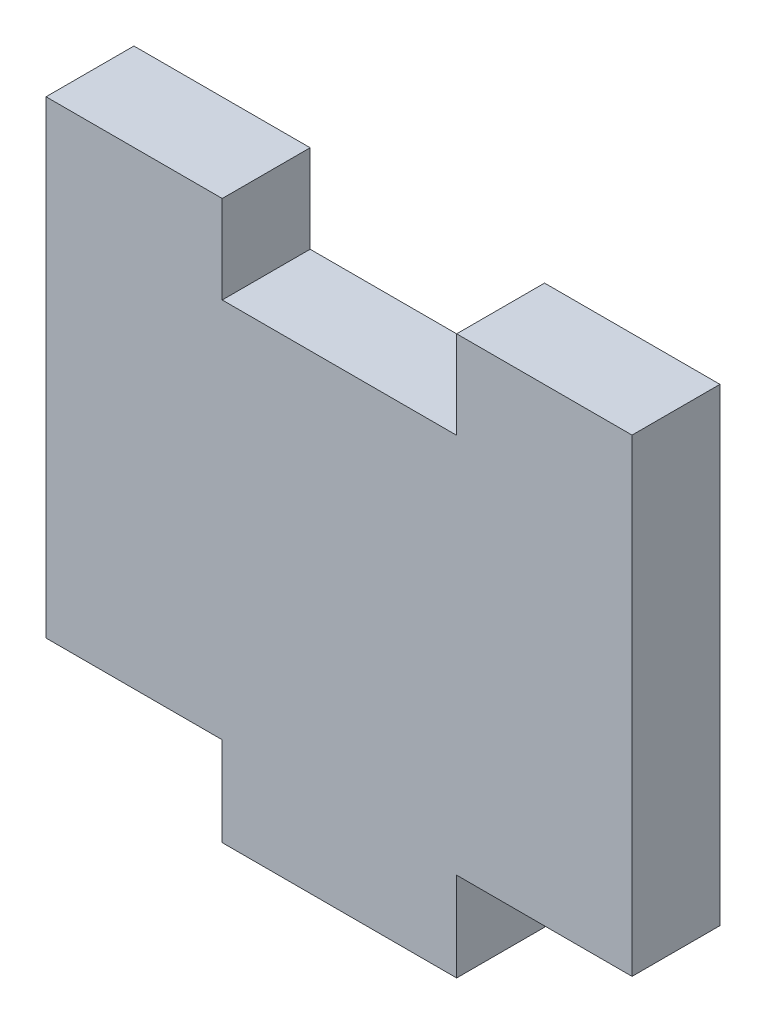
ISO-10303-21;
HEADER;
FILE_DESCRIPTION(('STEP AP214'),'2;1');
FILE_NAME('part.step','',(''),(''),'','','');
FILE_SCHEMA(('AUTOMOTIVE_DESIGN { 1 0 10303 214 1 1 1 1 }'));
ENDSEC;
DATA;
#1=APPLICATION_CONTEXT('core data for automotive mechanical design processes');
#2=APPLICATION_PROTOCOL_DEFINITION('international standard','automotive_design',2000,#1);
#3=PRODUCT_CONTEXT('',#1,'mechanical');
#4=PRODUCT('Part','Part','',(#3));
#5=PRODUCT_RELATED_PRODUCT_CATEGORY('part','',(#4));
#6=PRODUCT_DEFINITION_FORMATION('','',#4);
#7=PRODUCT_DEFINITION_CONTEXT('part definition',#1,'design');
#8=PRODUCT_DEFINITION('design','',#6,#7);
#9=PRODUCT_DEFINITION_SHAPE('','',#8);
#10=(LENGTH_UNIT() NAMED_UNIT(*) SI_UNIT(.MILLI.,.METRE.));
#11=(NAMED_UNIT(*) PLANE_ANGLE_UNIT() SI_UNIT($,.RADIAN.));
#12=(NAMED_UNIT(*) SI_UNIT($,.STERADIAN.) SOLID_ANGLE_UNIT());
#13=UNCERTAINTY_MEASURE_WITH_UNIT(LENGTH_MEASURE(1.E-05),#10,'distance_accuracy_value','');
#14=(GEOMETRIC_REPRESENTATION_CONTEXT(3) GLOBAL_UNCERTAINTY_ASSIGNED_CONTEXT((#13)) GLOBAL_UNIT_ASSIGNED_CONTEXT((#10,
#11,#12)) REPRESENTATION_CONTEXT('',''));
#15=CARTESIAN_POINT('',(0.,0.,0.));
#16=DIRECTION('',(0.,0.,1.));
#17=DIRECTION('',(1.,0.,0.));
#18=AXIS2_PLACEMENT_3D('',#15,#16,#17);
#19=CARTESIAN_POINT('',(0.,0.,9.525));
#20=DIRECTION('',(1.,0.,0.));
#21=DIRECTION('',(0.,0.,-1.));
#22=AXIS2_PLACEMENT_3D('',#19,#20,#21);
#23=PLANE('',#22);
#24=DIRECTION('',(0.,-1.,0.));
#25=VECTOR('',#24,1.);
#26=CARTESIAN_POINT('',(0.,0.,0.));
#27=LINE('',#26,#25);
#28=CARTESIAN_POINT('',(0.,50.8,0.));
#29=VERTEX_POINT('',#28);
#30=CARTESIAN_POINT('',(0.,0.,0.));
#31=VERTEX_POINT('',#30);
#32=EDGE_CURVE('E164',#29,#31,#27,.T.);
#33=ORIENTED_EDGE('',*,*,#32,.T.);
#34=DIRECTION('',(0.,0.,-1.));
#35=VECTOR('',#34,1.);
#36=CARTESIAN_POINT('',(0.,0.,9.525));
#37=LINE('',#36,#35);
#38=CARTESIAN_POINT('',(0.,0.,9.525));
#39=VERTEX_POINT('',#38);
#40=EDGE_CURVE('E11',#39,#31,#37,.T.);
#41=ORIENTED_EDGE('',*,*,#40,.F.);
#42=DIRECTION('',(0.,-1.,0.));
#43=VECTOR('',#42,1.);
#44=CARTESIAN_POINT('',(0.,0.,9.525));
#45=LINE('',#44,#43);
#46=CARTESIAN_POINT('',(0.,50.8,9.525));
#47=VERTEX_POINT('',#46);
#48=EDGE_CURVE('E199',#47,#39,#45,.T.);
#49=ORIENTED_EDGE('',*,*,#48,.F.);
#50=DIRECTION('',(0.,0.,-1.));
#51=VECTOR('',#50,1.);
#52=CARTESIAN_POINT('',(0.,50.8,9.525));
#53=LINE('',#52,#51);
#54=EDGE_CURVE('E160',#47,#29,#53,.T.);
#55=ORIENTED_EDGE('',*,*,#54,.T.);
#56=EDGE_LOOP('',(#33,#41,#49,#55));
#57=FACE_BOUND('',#56,.T.);
#58=ADVANCED_FACE('F39',(#57),#23,.F.);
#59=CARTESIAN_POINT('',(0.,0.,9.525));
#60=DIRECTION('',(0.,1.,0.));
#61=DIRECTION('',(0.,0.,1.));
#62=AXIS2_PLACEMENT_3D('',#59,#60,#61);
#63=PLANE('',#62);
#64=DIRECTION('',(1.,0.,0.));
#65=VECTOR('',#64,1.);
#66=CARTESIAN_POINT('',(0.,0.,0.));
#67=LINE('',#66,#65);
#68=CARTESIAN_POINT('',(19.0934901692059,0.,0.));
#69=VERTEX_POINT('',#68);
#70=EDGE_CURVE('E168',#31,#69,#67,.T.);
#71=ORIENTED_EDGE('',*,*,#70,.T.);
#72=DIRECTION('',(0.,0.,-1.));
#73=VECTOR('',#72,1.);
#74=CARTESIAN_POINT('',(19.0934901692059,0.,9.525));
#75=LINE('',#74,#73);
#76=CARTESIAN_POINT('',(19.0934901692059,0.,9.525));
#77=VERTEX_POINT('',#76);
#78=EDGE_CURVE('E48',#77,#69,#75,.T.);
#79=ORIENTED_EDGE('',*,*,#78,.F.);
#80=DIRECTION('',(1.,0.,0.));
#81=VECTOR('',#80,1.);
#82=CARTESIAN_POINT('',(0.,0.,9.525));
#83=LINE('',#82,#81);
#84=EDGE_CURVE('E111',#39,#77,#83,.T.);
#85=ORIENTED_EDGE('',*,*,#84,.F.);
#86=ORIENTED_EDGE('',*,*,#40,.T.);
#87=EDGE_LOOP('',(#71,#79,#85,#86));
#88=FACE_BOUND('',#87,.T.);
#89=ADVANCED_FACE('F293',(#88),#63,.F.);
#90=CARTESIAN_POINT('',(19.0934901692059,0.,9.525));
#91=DIRECTION('',(1.,0.,0.));
#92=DIRECTION('',(0.,0.,-1.));
#93=AXIS2_PLACEMENT_3D('',#90,#91,#92);
#94=PLANE('',#93);
#95=DIRECTION('',(0.,-1.,0.));
#96=VECTOR('',#95,1.);
#97=CARTESIAN_POINT('',(19.0934901692059,0.,0.));
#98=LINE('',#97,#96);
#99=CARTESIAN_POINT('',(19.0934901692059,-9.652,0.));
#100=VERTEX_POINT('',#99);
#101=EDGE_CURVE('E171',#69,#100,#98,.T.);
#102=ORIENTED_EDGE('',*,*,#101,.T.);
#103=DIRECTION('',(0.,0.,-1.));
#104=VECTOR('',#103,1.);
#105=CARTESIAN_POINT('',(19.0934901692059,-9.652,9.525));
#106=LINE('',#105,#104);
#107=CARTESIAN_POINT('',(19.0934901692059,-9.652,9.525));
#108=VERTEX_POINT('',#107);
#109=EDGE_CURVE('E226',#108,#100,#106,.T.);
#110=ORIENTED_EDGE('',*,*,#109,.F.);
#111=DIRECTION('',(0.,-1.,0.));
#112=VECTOR('',#111,1.);
#113=CARTESIAN_POINT('',(19.0934901692059,0.,9.525));
#114=LINE('',#113,#112);
#115=EDGE_CURVE('E236',#77,#108,#114,.T.);
#116=ORIENTED_EDGE('',*,*,#115,.F.);
#117=ORIENTED_EDGE('',*,*,#78,.T.);
#118=EDGE_LOOP('',(#102,#110,#116,#117));
#119=FACE_BOUND('',#118,.T.);
#120=ADVANCED_FACE('F234',(#119),#94,.F.);
#121=CARTESIAN_POINT('',(19.0934901692059,-9.652,9.525));
#122=DIRECTION('',(0.,1.,0.));
#123=DIRECTION('',(0.,0.,1.));
#124=AXIS2_PLACEMENT_3D('',#121,#122,#123);
#125=PLANE('',#124);
#126=DIRECTION('',(1.,0.,0.));
#127=VECTOR('',#126,1.);
#128=CARTESIAN_POINT('',(19.0934901692059,-9.652,0.));
#129=LINE('',#128,#127);
#130=CARTESIAN_POINT('',(44.4934901692059,-9.652,0.));
#131=VERTEX_POINT('',#130);
#132=EDGE_CURVE('E174',#100,#131,#129,.T.);
#133=ORIENTED_EDGE('',*,*,#132,.T.);
#134=DIRECTION('',(0.,0.,-1.));
#135=VECTOR('',#134,1.);
#136=CARTESIAN_POINT('',(44.4934901692059,-9.652,9.525));
#137=LINE('',#136,#135);
#138=CARTESIAN_POINT('',(44.4934901692059,-9.652,9.525));
#139=VERTEX_POINT('',#138);
#140=EDGE_CURVE('E222',#139,#131,#137,.T.);
#141=ORIENTED_EDGE('',*,*,#140,.F.);
#142=DIRECTION('',(1.,0.,0.));
#143=VECTOR('',#142,1.);
#144=CARTESIAN_POINT('',(19.0934901692059,-9.652,9.525));
#145=LINE('',#144,#143);
#146=EDGE_CURVE('E255',#108,#139,#145,.T.);
#147=ORIENTED_EDGE('',*,*,#146,.F.);
#148=ORIENTED_EDGE('',*,*,#109,.T.);
#149=EDGE_LOOP('',(#133,#141,#147,#148));
#150=FACE_BOUND('',#149,.T.);
#151=ADVANCED_FACE('F245',(#150),#125,.F.);
#152=CARTESIAN_POINT('',(44.4934901692059,0.,9.525));
#153=DIRECTION('',(-1.,0.,0.));
#154=DIRECTION('',(0.,-1.,0.));
#155=AXIS2_PLACEMENT_3D('',#152,#153,#154);
#156=PLANE('',#155);
#157=DIRECTION('',(0.,1.,0.));
#158=VECTOR('',#157,1.);
#159=CARTESIAN_POINT('',(44.4934901692059,0.,0.));
#160=LINE('',#159,#158);
#161=CARTESIAN_POINT('',(44.4934901692059,0.,0.));
#162=VERTEX_POINT('',#161);
#163=EDGE_CURVE('E177',#131,#162,#160,.T.);
#164=ORIENTED_EDGE('',*,*,#163,.T.);
#165=DIRECTION('',(0.,0.,-1.));
#166=VECTOR('',#165,1.);
#167=CARTESIAN_POINT('',(44.4934901692059,0.,9.525));
#168=LINE('',#167,#166);
#169=CARTESIAN_POINT('',(44.4934901692059,0.,9.525));
#170=VERTEX_POINT('',#169);
#171=EDGE_CURVE('E218',#170,#162,#168,.T.);
#172=ORIENTED_EDGE('',*,*,#171,.F.);
#173=DIRECTION('',(0.,1.,0.));
#174=VECTOR('',#173,1.);
#175=CARTESIAN_POINT('',(44.4934901692059,0.,9.525));
#176=LINE('',#175,#174);
#177=EDGE_CURVE('E251',#139,#170,#176,.T.);
#178=ORIENTED_EDGE('',*,*,#177,.F.);
#179=ORIENTED_EDGE('',*,*,#140,.T.);
#180=EDGE_LOOP('',(#164,#172,#178,#179));
#181=FACE_BOUND('',#180,.T.);
#182=ADVANCED_FACE('F249',(#181),#156,.F.);
#183=CARTESIAN_POINT('',(44.4934901692059,0.,9.525));
#184=DIRECTION('',(0.,1.,0.));
#185=DIRECTION('',(0.,0.,1.));
#186=AXIS2_PLACEMENT_3D('',#183,#184,#185);
#187=PLANE('',#186);
#188=DIRECTION('',(1.,0.,0.));
#189=VECTOR('',#188,1.);
#190=CARTESIAN_POINT('',(44.4934901692059,0.,0.));
#191=LINE('',#190,#189);
#192=CARTESIAN_POINT('',(63.5,0.,0.));
#193=VERTEX_POINT('',#192);
#194=EDGE_CURVE('E180',#162,#193,#191,.T.);
#195=ORIENTED_EDGE('',*,*,#194,.T.);
#196=DIRECTION('',(0.,0.,-1.));
#197=VECTOR('',#196,1.);
#198=CARTESIAN_POINT('',(63.5,0.,9.525));
#199=LINE('',#198,#197);
#200=CARTESIAN_POINT('',(63.5,0.,9.525));
#201=VERTEX_POINT('',#200);
#202=EDGE_CURVE('E214',#201,#193,#199,.T.);
#203=ORIENTED_EDGE('',*,*,#202,.F.);
#204=DIRECTION('',(1.,0.,0.));
#205=VECTOR('',#204,1.);
#206=CARTESIAN_POINT('',(44.4934901692059,0.,9.525));
#207=LINE('',#206,#205);
#208=EDGE_CURVE('E254',#170,#201,#207,.T.);
#209=ORIENTED_EDGE('',*,*,#208,.F.);
#210=ORIENTED_EDGE('',*,*,#171,.T.);
#211=EDGE_LOOP('',(#195,#203,#209,#210));
#212=FACE_BOUND('',#211,.T.);
#213=ADVANCED_FACE('F306',(#212),#187,.F.);
#214=CARTESIAN_POINT('',(63.5,38.1,9.525));
#215=DIRECTION('',(-1.,0.,0.));
#216=DIRECTION('',(0.,0.,1.));
#217=AXIS2_PLACEMENT_3D('',#214,#215,#216);
#218=PLANE('',#217);
#219=DIRECTION('',(0.,1.,0.));
#220=VECTOR('',#219,1.);
#221=CARTESIAN_POINT('',(63.5,38.1,0.));
#222=LINE('',#221,#220);
#223=CARTESIAN_POINT('',(63.5,50.8,0.));
#224=VERTEX_POINT('',#223);
#225=EDGE_CURVE('E184',#193,#224,#222,.T.);
#226=ORIENTED_EDGE('',*,*,#225,.T.);
#227=DIRECTION('',(0.,0.,-1.));
#228=VECTOR('',#227,1.);
#229=CARTESIAN_POINT('',(63.5,50.8,9.525));
#230=LINE('',#229,#228);
#231=CARTESIAN_POINT('',(63.5,50.8,9.525));
#232=VERTEX_POINT('',#231);
#233=EDGE_CURVE('E210',#232,#224,#230,.T.);
#234=ORIENTED_EDGE('',*,*,#233,.F.);
#235=DIRECTION('',(0.,1.,0.));
#236=VECTOR('',#235,1.);
#237=CARTESIAN_POINT('',(63.5,0.,9.525));
#238=LINE('',#237,#236);
#239=EDGE_CURVE('E259',#201,#232,#238,.T.);
#240=ORIENTED_EDGE('',*,*,#239,.F.);
#241=ORIENTED_EDGE('',*,*,#202,.T.);
#242=EDGE_LOOP('',(#226,#234,#240,#241));
#243=FACE_BOUND('',#242,.T.);
#244=ADVANCED_FACE('F309',(#243),#218,.F.);
#245=CARTESIAN_POINT('',(44.4934901692059,50.8,9.525));
#246=DIRECTION('',(0.,-1.,0.));
#247=DIRECTION('',(0.,0.,-1.));
#248=AXIS2_PLACEMENT_3D('',#245,#246,#247);
#249=PLANE('',#248);
#250=DIRECTION('',(-1.,0.,0.));
#251=VECTOR('',#250,1.);
#252=CARTESIAN_POINT('',(44.4934901692059,50.8,0.));
#253=LINE('',#252,#251);
#254=CARTESIAN_POINT('',(44.4934901692059,50.8,0.));
#255=VERTEX_POINT('',#254);
#256=EDGE_CURVE('E187',#224,#255,#253,.T.);
#257=ORIENTED_EDGE('',*,*,#256,.T.);
#258=DIRECTION('',(0.,0.,-1.));
#259=VECTOR('',#258,1.);
#260=CARTESIAN_POINT('',(44.4934901692059,50.8,9.525));
#261=LINE('',#260,#259);
#262=CARTESIAN_POINT('',(44.4934901692059,50.8,9.525));
#263=VERTEX_POINT('',#262);
#264=EDGE_CURVE('E206',#263,#255,#261,.T.);
#265=ORIENTED_EDGE('',*,*,#264,.F.);
#266=DIRECTION('',(-1.,0.,0.));
#267=VECTOR('',#266,1.);
#268=CARTESIAN_POINT('',(44.4934901692059,50.8,9.525));
#269=LINE('',#268,#267);
#270=EDGE_CURVE('E266',#232,#263,#269,.T.);
#271=ORIENTED_EDGE('',*,*,#270,.F.);
#272=ORIENTED_EDGE('',*,*,#233,.T.);
#273=EDGE_LOOP('',(#257,#265,#271,#272));
#274=FACE_BOUND('',#273,.T.);
#275=ADVANCED_FACE('F274',(#274),#249,.F.);
#276=CARTESIAN_POINT('',(44.4934901692059,50.8,9.525));
#277=DIRECTION('',(1.,0.,0.));
#278=DIRECTION('',(0.,0.,-1.));
#279=AXIS2_PLACEMENT_3D('',#276,#277,#278);
#280=PLANE('',#279);
#281=DIRECTION('',(0.,-1.,0.));
#282=VECTOR('',#281,1.);
#283=CARTESIAN_POINT('',(44.4934901692059,50.8,0.));
#284=LINE('',#283,#282);
#285=CARTESIAN_POINT('',(44.4934901692059,41.275,0.));
#286=VERTEX_POINT('',#285);
#287=EDGE_CURVE('E190',#255,#286,#284,.T.);
#288=ORIENTED_EDGE('',*,*,#287,.T.);
#289=DIRECTION('',(0.,0.,-1.));
#290=VECTOR('',#289,1.);
#291=CARTESIAN_POINT('',(44.4934901692059,41.275,9.525));
#292=LINE('',#291,#290);
#293=CARTESIAN_POINT('',(44.4934901692059,41.275,9.525));
#294=VERTEX_POINT('',#293);
#295=EDGE_CURVE('E153',#294,#286,#292,.T.);
#296=ORIENTED_EDGE('',*,*,#295,.F.);
#297=DIRECTION('',(0.,-1.,0.));
#298=VECTOR('',#297,1.);
#299=CARTESIAN_POINT('',(44.4934901692059,50.8,9.525));
#300=LINE('',#299,#298);
#301=EDGE_CURVE('E142',#263,#294,#300,.T.);
#302=ORIENTED_EDGE('',*,*,#301,.F.);
#303=ORIENTED_EDGE('',*,*,#264,.T.);
#304=EDGE_LOOP('',(#288,#296,#302,#303));
#305=FACE_BOUND('',#304,.T.);
#306=ADVANCED_FACE('F278',(#305),#280,.F.);
#307=CARTESIAN_POINT('',(19.0934901692059,41.275,9.525));
#308=DIRECTION('',(0.,-1.,0.));
#309=DIRECTION('',(0.,0.,-1.));
#310=AXIS2_PLACEMENT_3D('',#307,#308,#309);
#311=PLANE('',#310);
#312=DIRECTION('',(-1.,0.,0.));
#313=VECTOR('',#312,1.);
#314=CARTESIAN_POINT('',(19.0934901692059,41.275,0.));
#315=LINE('',#314,#313);
#316=CARTESIAN_POINT('',(19.0934901692059,41.275,0.));
#317=VERTEX_POINT('',#316);
#318=EDGE_CURVE('E151',#286,#317,#315,.T.);
#319=ORIENTED_EDGE('',*,*,#318,.T.);
#320=DIRECTION('',(0.,0.,-1.));
#321=VECTOR('',#320,1.);
#322=CARTESIAN_POINT('',(19.0934901692059,41.275,9.525));
#323=LINE('',#322,#321);
#324=CARTESIAN_POINT('',(19.0934901692059,41.275,9.525));
#325=VERTEX_POINT('',#324);
#326=EDGE_CURVE('E148',#325,#317,#323,.T.);
#327=ORIENTED_EDGE('',*,*,#326,.F.);
#328=DIRECTION('',(-1.,0.,0.));
#329=VECTOR('',#328,1.);
#330=CARTESIAN_POINT('',(19.0934901692059,41.275,9.525));
#331=LINE('',#330,#329);
#332=EDGE_CURVE('E136',#294,#325,#331,.T.);
#333=ORIENTED_EDGE('',*,*,#332,.F.);
#334=ORIENTED_EDGE('',*,*,#295,.T.);
#335=EDGE_LOOP('',(#319,#327,#333,#334));
#336=FACE_BOUND('',#335,.T.);
#337=ADVANCED_FACE('F149',(#336),#311,.F.);
#338=CARTESIAN_POINT('',(19.0934901692059,50.8,9.525));
#339=DIRECTION('',(-1.,0.,0.));
#340=DIRECTION('',(0.,0.,1.));
#341=AXIS2_PLACEMENT_3D('',#338,#339,#340);
#342=PLANE('',#341);
#343=DIRECTION('',(0.,1.,0.));
#344=VECTOR('',#343,1.);
#345=CARTESIAN_POINT('',(19.0934901692059,50.8,0.));
#346=LINE('',#345,#344);
#347=CARTESIAN_POINT('',(19.0934901692059,50.8,0.));
#348=VERTEX_POINT('',#347);
#349=EDGE_CURVE('E97',#317,#348,#346,.T.);
#350=ORIENTED_EDGE('',*,*,#349,.T.);
#351=DIRECTION('',(0.,0.,-1.));
#352=VECTOR('',#351,1.);
#353=CARTESIAN_POINT('',(19.0934901692059,50.8,9.525));
#354=LINE('',#353,#352);
#355=CARTESIAN_POINT('',(19.0934901692059,50.8,9.525));
#356=VERTEX_POINT('',#355);
#357=EDGE_CURVE('E154',#356,#348,#354,.T.);
#358=ORIENTED_EDGE('',*,*,#357,.F.);
#359=DIRECTION('',(0.,1.,0.));
#360=VECTOR('',#359,1.);
#361=CARTESIAN_POINT('',(19.0934901692059,50.8,9.525));
#362=LINE('',#361,#360);
#363=EDGE_CURVE('E140',#325,#356,#362,.T.);
#364=ORIENTED_EDGE('',*,*,#363,.F.);
#365=ORIENTED_EDGE('',*,*,#326,.T.);
#366=EDGE_LOOP('',(#350,#358,#364,#365));
#367=FACE_BOUND('',#366,.T.);
#368=ADVANCED_FACE('F156',(#367),#342,.F.);
#369=CARTESIAN_POINT('',(0.,50.8,9.525));
#370=DIRECTION('',(0.,-1.,0.));
#371=DIRECTION('',(0.,0.,-1.));
#372=AXIS2_PLACEMENT_3D('',#369,#370,#371);
#373=PLANE('',#372);
#374=DIRECTION('',(-1.,0.,0.));
#375=VECTOR('',#374,1.);
#376=CARTESIAN_POINT('',(0.,50.8,0.));
#377=LINE('',#376,#375);
#378=EDGE_CURVE('E103',#348,#29,#377,.T.);
#379=ORIENTED_EDGE('',*,*,#378,.T.);
#380=ORIENTED_EDGE('',*,*,#54,.F.);
#381=DIRECTION('',(-1.,0.,0.));
#382=VECTOR('',#381,1.);
#383=CARTESIAN_POINT('',(0.,50.8,9.525));
#384=LINE('',#383,#382);
#385=EDGE_CURVE('E56',#356,#47,#384,.T.);
#386=ORIENTED_EDGE('',*,*,#385,.F.);
#387=ORIENTED_EDGE('',*,*,#357,.T.);
#388=EDGE_LOOP('',(#379,#380,#386,#387));
#389=FACE_BOUND('',#388,.T.);
#390=ADVANCED_FACE('F282',(#389),#373,.F.);
#391=CARTESIAN_POINT('',(0.,0.,9.525));
#392=DIRECTION('',(0.,0.,-1.));
#393=DIRECTION('',(-1.,0.,0.));
#394=AXIS2_PLACEMENT_3D('',#391,#392,#393);
#395=PLANE('',#394);
#396=ORIENTED_EDGE('',*,*,#48,.T.);
#397=ORIENTED_EDGE('',*,*,#84,.T.);
#398=ORIENTED_EDGE('',*,*,#115,.T.);
#399=ORIENTED_EDGE('',*,*,#146,.T.);
#400=ORIENTED_EDGE('',*,*,#177,.T.);
#401=ORIENTED_EDGE('',*,*,#208,.T.);
#402=ORIENTED_EDGE('',*,*,#239,.T.);
#403=ORIENTED_EDGE('',*,*,#270,.T.);
#404=ORIENTED_EDGE('',*,*,#301,.T.);
#405=ORIENTED_EDGE('',*,*,#332,.T.);
#406=ORIENTED_EDGE('',*,*,#363,.T.);
#407=ORIENTED_EDGE('',*,*,#385,.T.);
#408=EDGE_LOOP('',(#396,#397,#398,#399,#400,#401,#402,#403,#404,#405,#406,#407));
#409=FACE_BOUND('',#408,.T.);
#410=ADVANCED_FACE('F138',(#409),#395,.F.);
#411=CARTESIAN_POINT('',(0.,0.,0.));
#412=DIRECTION('',(0.,0.,-1.));
#413=DIRECTION('',(-1.,0.,0.));
#414=AXIS2_PLACEMENT_3D('',#411,#412,#413);
#415=PLANE('',#414);
#416=ORIENTED_EDGE('',*,*,#32,.F.);
#417=ORIENTED_EDGE('',*,*,#378,.F.);
#418=ORIENTED_EDGE('',*,*,#349,.F.);
#419=ORIENTED_EDGE('',*,*,#318,.F.);
#420=ORIENTED_EDGE('',*,*,#287,.F.);
#421=ORIENTED_EDGE('',*,*,#256,.F.);
#422=ORIENTED_EDGE('',*,*,#225,.F.);
#423=ORIENTED_EDGE('',*,*,#194,.F.);
#424=ORIENTED_EDGE('',*,*,#163,.F.);
#425=ORIENTED_EDGE('',*,*,#132,.F.);
#426=ORIENTED_EDGE('',*,*,#101,.F.);
#427=ORIENTED_EDGE('',*,*,#70,.F.);
#428=EDGE_LOOP('',(#416,#417,#418,#419,#420,#421,#422,#423,#424,#425,#426,#427));
#429=FACE_BOUND('',#428,.T.);
#430=ADVANCED_FACE('F240',(#429),#415,.T.);
#431=CLOSED_SHELL('',(#58,#89,#120,#151,#182,#213,#244,#275,#306,#337,#368,#390,#410,#430));
#432=MANIFOLD_SOLID_BREP('B2',#431);
#433=ADVANCED_BREP_SHAPE_REPRESENTATION('',(#18,#432),#14);
#434=SHAPE_DEFINITION_REPRESENTATION(#9,#433);
ENDSEC;
END-ISO-10303-21;
